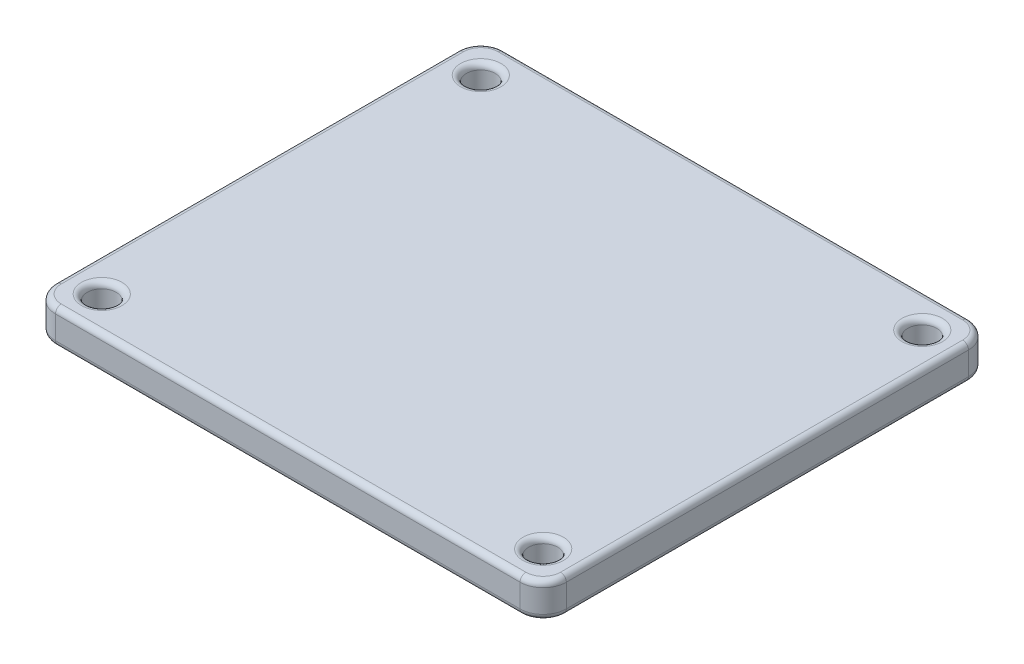
ISO-10303-21;
HEADER;
FILE_DESCRIPTION(('STEP AP214'),'2;1');
FILE_NAME('part.step','',(''),(''),'','','');
FILE_SCHEMA(('AUTOMOTIVE_DESIGN { 1 0 10303 214 1 1 1 1 }'));
ENDSEC;
DATA;
#1=APPLICATION_CONTEXT('core data for automotive mechanical design processes');
#2=APPLICATION_PROTOCOL_DEFINITION('international standard','automotive_design',2000,#1);
#3=PRODUCT_CONTEXT('',#1,'mechanical');
#4=PRODUCT('Part','Part','',(#3));
#5=PRODUCT_RELATED_PRODUCT_CATEGORY('part','',(#4));
#6=PRODUCT_DEFINITION_FORMATION('','',#4);
#7=PRODUCT_DEFINITION_CONTEXT('part definition',#1,'design');
#8=PRODUCT_DEFINITION('design','',#6,#7);
#9=PRODUCT_DEFINITION_SHAPE('','',#8);
#10=(LENGTH_UNIT() NAMED_UNIT(*) SI_UNIT(.MILLI.,.METRE.));
#11=(NAMED_UNIT(*) PLANE_ANGLE_UNIT() SI_UNIT($,.RADIAN.));
#12=(NAMED_UNIT(*) SI_UNIT($,.STERADIAN.) SOLID_ANGLE_UNIT());
#13=UNCERTAINTY_MEASURE_WITH_UNIT(LENGTH_MEASURE(1.E-05),#10,'distance_accuracy_value','');
#14=(GEOMETRIC_REPRESENTATION_CONTEXT(3) GLOBAL_UNCERTAINTY_ASSIGNED_CONTEXT((#13)) GLOBAL_UNIT_ASSIGNED_CONTEXT((#10,
#11,#12)) REPRESENTATION_CONTEXT('',''));
#15=CARTESIAN_POINT('',(0.,0.,0.));
#16=DIRECTION('',(0.,0.,1.));
#17=DIRECTION('',(1.,0.,0.));
#18=AXIS2_PLACEMENT_3D('',#15,#16,#17);
#19=CARTESIAN_POINT('',(20.1,3.,-17.4));
#20=DIRECTION('',(0.,-1.,0.));
#21=DIRECTION('',(0.,0.,-1.));
#22=AXIS2_PLACEMENT_3D('',#19,#20,#21);
#23=PLANE('',#22);
#24=CARTESIAN_POINT('',(-19.1,3.,16.4));
#25=DIRECTION('',(0.,-1.,0.));
#26=DIRECTION('',(0.,0.,-1.));
#27=AXIS2_PLACEMENT_3D('',#24,#25,#26);
#28=CIRCLE('',#27,1.75);
#29=CARTESIAN_POINT('',(-19.1,3.,14.65));
#30=VERTEX_POINT('',#29);
#31=EDGE_CURVE('E11',#30,#30,#28,.T.);
#32=ORIENTED_EDGE('',*,*,#31,.T.);
#33=EDGE_LOOP('',(#32));
#34=FACE_BOUND('',#33,.T.);
#35=CARTESIAN_POINT('',(19.1,3.,16.4));
#36=DIRECTION('',(0.,-1.,0.));
#37=DIRECTION('',(0.,0.,-1.));
#38=AXIS2_PLACEMENT_3D('',#35,#36,#37);
#39=CIRCLE('',#38,1.75);
#40=CARTESIAN_POINT('',(19.1,3.,14.65));
#41=VERTEX_POINT('',#40);
#42=EDGE_CURVE('E42',#41,#41,#39,.T.);
#43=ORIENTED_EDGE('',*,*,#42,.T.);
#44=EDGE_LOOP('',(#43));
#45=FACE_BOUND('',#44,.T.);
#46=CARTESIAN_POINT('',(19.1,3.,-16.4));
#47=DIRECTION('',(0.,-1.,0.));
#48=DIRECTION('',(0.,0.,-1.));
#49=AXIS2_PLACEMENT_3D('',#46,#47,#48);
#50=CIRCLE('',#49,1.75);
#51=CARTESIAN_POINT('',(19.1,3.,-18.15));
#52=VERTEX_POINT('',#51);
#53=EDGE_CURVE('E260',#52,#52,#50,.T.);
#54=ORIENTED_EDGE('',*,*,#53,.T.);
#55=EDGE_LOOP('',(#54));
#56=FACE_BOUND('',#55,.T.);
#57=CARTESIAN_POINT('',(-19.1,3.,-16.4));
#58=DIRECTION('',(0.,-1.,0.));
#59=DIRECTION('',(0.,0.,-1.));
#60=AXIS2_PLACEMENT_3D('',#57,#58,#59);
#61=CIRCLE('',#60,1.75);
#62=CARTESIAN_POINT('',(-19.1,3.,-18.15));
#63=VERTEX_POINT('',#62);
#64=EDGE_CURVE('E257',#63,#63,#61,.T.);
#65=ORIENTED_EDGE('',*,*,#64,.T.);
#66=EDGE_LOOP('',(#65));
#67=FACE_BOUND('',#66,.T.);
#68=CARTESIAN_POINT('',(20.1,3.,17.4));
#69=DIRECTION('',(0.,-1.,0.));
#70=DIRECTION('',(0.,0.,-1.));
#71=AXIS2_PLACEMENT_3D('',#68,#69,#70);
#72=CIRCLE('',#71,1.5);
#73=CARTESIAN_POINT('',(20.1,3.,18.9));
#74=VERTEX_POINT('',#73);
#75=CARTESIAN_POINT('',(21.6,3.,17.4));
#76=VERTEX_POINT('',#75);
#77=EDGE_CURVE('E50',#74,#76,#72,.F.);
#78=ORIENTED_EDGE('',*,*,#77,.T.);
#79=DIRECTION('',(0.,0.,-1.));
#80=VECTOR('',#79,1.);
#81=CARTESIAN_POINT('',(21.6,3.,-17.4));
#82=LINE('',#81,#80);
#83=CARTESIAN_POINT('',(21.6,3.,-17.4));
#84=VERTEX_POINT('',#83);
#85=EDGE_CURVE('E255',#76,#84,#82,.T.);
#86=ORIENTED_EDGE('',*,*,#85,.T.);
#87=CARTESIAN_POINT('',(20.1,3.,-17.4));
#88=DIRECTION('',(0.,-1.,0.));
#89=DIRECTION('',(0.,0.,-1.));
#90=AXIS2_PLACEMENT_3D('',#87,#88,#89);
#91=CIRCLE('',#90,1.5);
#92=CARTESIAN_POINT('',(20.1,3.,-18.9));
#93=VERTEX_POINT('',#92);
#94=EDGE_CURVE('E243',#84,#93,#91,.F.);
#95=ORIENTED_EDGE('',*,*,#94,.T.);
#96=DIRECTION('',(-1.,0.,0.));
#97=VECTOR('',#96,1.);
#98=CARTESIAN_POINT('',(20.1,3.,-18.9));
#99=LINE('',#98,#97);
#100=CARTESIAN_POINT('',(-20.1,3.,-18.9));
#101=VERTEX_POINT('',#100);
#102=EDGE_CURVE('E245',#93,#101,#99,.T.);
#103=ORIENTED_EDGE('',*,*,#102,.T.);
#104=CARTESIAN_POINT('',(-20.1,3.,-17.4));
#105=DIRECTION('',(0.,-1.,0.));
#106=DIRECTION('',(0.,0.,-1.));
#107=AXIS2_PLACEMENT_3D('',#104,#105,#106);
#108=CIRCLE('',#107,1.5);
#109=CARTESIAN_POINT('',(-21.6,3.,-17.4));
#110=VERTEX_POINT('',#109);
#111=EDGE_CURVE('E247',#101,#110,#108,.F.);
#112=ORIENTED_EDGE('',*,*,#111,.T.);
#113=DIRECTION('',(0.,0.,1.));
#114=VECTOR('',#113,1.);
#115=CARTESIAN_POINT('',(-21.6,3.,-17.4));
#116=LINE('',#115,#114);
#117=CARTESIAN_POINT('',(-21.6,3.,17.4));
#118=VERTEX_POINT('',#117);
#119=EDGE_CURVE('E249',#110,#118,#116,.T.);
#120=ORIENTED_EDGE('',*,*,#119,.T.);
#121=CARTESIAN_POINT('',(-20.1,3.,17.4));
#122=DIRECTION('',(0.,-1.,0.));
#123=DIRECTION('',(0.,0.,-1.));
#124=AXIS2_PLACEMENT_3D('',#121,#122,#123);
#125=CIRCLE('',#124,1.5);
#126=CARTESIAN_POINT('',(-20.1,3.,18.9));
#127=VERTEX_POINT('',#126);
#128=EDGE_CURVE('E251',#118,#127,#125,.F.);
#129=ORIENTED_EDGE('',*,*,#128,.T.);
#130=DIRECTION('',(1.,0.,0.));
#131=VECTOR('',#130,1.);
#132=CARTESIAN_POINT('',(20.1,3.,18.9));
#133=LINE('',#132,#131);
#134=EDGE_CURVE('E55',#127,#74,#133,.T.);
#135=ORIENTED_EDGE('',*,*,#134,.T.);
#136=EDGE_LOOP('',(#78,#86,#95,#103,#112,#120,#129,#135));
#137=FACE_BOUND('',#136,.T.);
#138=ADVANCED_FACE('F33',(#34,#45,#56,#67,#137),#23,.F.);
#139=CARTESIAN_POINT('',(20.1,0.,-17.4));
#140=DIRECTION('',(0.,-1.,0.));
#141=DIRECTION('',(0.,0.,-1.));
#142=AXIS2_PLACEMENT_3D('',#139,#140,#141);
#143=PLANE('',#142);
#144=CARTESIAN_POINT('',(-19.1,0.,16.4));
#145=DIRECTION('',(0.,-1.,0.));
#146=DIRECTION('',(0.,0.,-1.));
#147=AXIS2_PLACEMENT_3D('',#144,#145,#146);
#148=CIRCLE('',#147,1.75);
#149=CARTESIAN_POINT('',(-19.1,0.,14.65));
#150=VERTEX_POINT('',#149);
#151=EDGE_CURVE('E179',#150,#150,#148,.F.);
#152=ORIENTED_EDGE('',*,*,#151,.T.);
#153=EDGE_LOOP('',(#152));
#154=FACE_BOUND('',#153,.T.);
#155=CARTESIAN_POINT('',(19.1,0.,-16.4));
#156=DIRECTION('',(0.,-1.,0.));
#157=DIRECTION('',(0.,0.,-1.));
#158=AXIS2_PLACEMENT_3D('',#155,#156,#157);
#159=CIRCLE('',#158,1.75);
#160=CARTESIAN_POINT('',(19.1,0.,-18.15));
#161=VERTEX_POINT('',#160);
#162=EDGE_CURVE('E176',#161,#161,#159,.F.);
#163=ORIENTED_EDGE('',*,*,#162,.T.);
#164=EDGE_LOOP('',(#163));
#165=FACE_BOUND('',#164,.T.);
#166=CARTESIAN_POINT('',(-20.1,0.,-17.4));
#167=DIRECTION('',(0.,-1.,0.));
#168=DIRECTION('',(0.,0.,-1.));
#169=AXIS2_PLACEMENT_3D('',#166,#167,#168);
#170=CIRCLE('',#169,1.5);
#171=CARTESIAN_POINT('',(-21.6,0.,-17.4));
#172=VERTEX_POINT('',#171);
#173=CARTESIAN_POINT('',(-20.1,0.,-18.9));
#174=VERTEX_POINT('',#173);
#175=EDGE_CURVE('E175',#172,#174,#170,.T.);
#176=ORIENTED_EDGE('',*,*,#175,.T.);
#177=DIRECTION('',(-1.,0.,0.));
#178=VECTOR('',#177,1.);
#179=CARTESIAN_POINT('',(20.1,0.,-18.9));
#180=LINE('',#179,#178);
#181=CARTESIAN_POINT('',(20.1,0.,-18.9));
#182=VERTEX_POINT('',#181);
#183=EDGE_CURVE('E153',#174,#182,#180,.F.);
#184=ORIENTED_EDGE('',*,*,#183,.T.);
#185=CARTESIAN_POINT('',(20.1,0.,-17.4));
#186=DIRECTION('',(0.,-1.,0.));
#187=DIRECTION('',(0.,0.,-1.));
#188=AXIS2_PLACEMENT_3D('',#185,#186,#187);
#189=CIRCLE('',#188,1.5);
#190=CARTESIAN_POINT('',(21.6,0.,-17.4));
#191=VERTEX_POINT('',#190);
#192=EDGE_CURVE('E163',#182,#191,#189,.T.);
#193=ORIENTED_EDGE('',*,*,#192,.T.);
#194=DIRECTION('',(0.,0.,-1.));
#195=VECTOR('',#194,1.);
#196=CARTESIAN_POINT('',(21.6,0.,17.4));
#197=LINE('',#196,#195);
#198=CARTESIAN_POINT('',(21.6,0.,17.4));
#199=VERTEX_POINT('',#198);
#200=EDGE_CURVE('E169',#191,#199,#197,.F.);
#201=ORIENTED_EDGE('',*,*,#200,.T.);
#202=CARTESIAN_POINT('',(20.1,0.,17.4));
#203=DIRECTION('',(0.,-1.,0.));
#204=DIRECTION('',(0.,0.,-1.));
#205=AXIS2_PLACEMENT_3D('',#202,#203,#204);
#206=CIRCLE('',#205,1.5);
#207=CARTESIAN_POINT('',(20.1,0.,18.9));
#208=VERTEX_POINT('',#207);
#209=EDGE_CURVE('E343',#199,#208,#206,.T.);
#210=ORIENTED_EDGE('',*,*,#209,.T.);
#211=DIRECTION('',(1.,0.,0.));
#212=VECTOR('',#211,1.);
#213=CARTESIAN_POINT('',(-20.1,0.,18.9));
#214=LINE('',#213,#212);
#215=CARTESIAN_POINT('',(-20.1,0.,18.9));
#216=VERTEX_POINT('',#215);
#217=EDGE_CURVE('E345',#208,#216,#214,.F.);
#218=ORIENTED_EDGE('',*,*,#217,.T.);
#219=CARTESIAN_POINT('',(-20.1,0.,17.4));
#220=DIRECTION('',(0.,-1.,0.));
#221=DIRECTION('',(0.,0.,-1.));
#222=AXIS2_PLACEMENT_3D('',#219,#220,#221);
#223=CIRCLE('',#222,1.5);
#224=CARTESIAN_POINT('',(-21.6,0.,17.4));
#225=VERTEX_POINT('',#224);
#226=EDGE_CURVE('E347',#216,#225,#223,.T.);
#227=ORIENTED_EDGE('',*,*,#226,.T.);
#228=DIRECTION('',(0.,0.,1.));
#229=VECTOR('',#228,1.);
#230=CARTESIAN_POINT('',(-21.6,0.,-17.4));
#231=LINE('',#230,#229);
#232=EDGE_CURVE('E181',#225,#172,#231,.F.);
#233=ORIENTED_EDGE('',*,*,#232,.T.);
#234=EDGE_LOOP('',(#176,#184,#193,#201,#210,#218,#227,#233));
#235=FACE_BOUND('',#234,.T.);
#236=CARTESIAN_POINT('',(-19.1,0.,-16.4));
#237=DIRECTION('',(0.,-1.,0.));
#238=DIRECTION('',(0.,0.,-1.));
#239=AXIS2_PLACEMENT_3D('',#236,#237,#238);
#240=CIRCLE('',#239,1.75);
#241=CARTESIAN_POINT('',(-19.1,0.,-18.15));
#242=VERTEX_POINT('',#241);
#243=EDGE_CURVE('E170',#242,#242,#240,.F.);
#244=ORIENTED_EDGE('',*,*,#243,.T.);
#245=EDGE_LOOP('',(#244));
#246=FACE_BOUND('',#245,.T.);
#247=CARTESIAN_POINT('',(19.1,0.,16.4));
#248=DIRECTION('',(0.,-1.,0.));
#249=DIRECTION('',(0.,0.,-1.));
#250=AXIS2_PLACEMENT_3D('',#247,#248,#249);
#251=CIRCLE('',#250,1.75);
#252=CARTESIAN_POINT('',(19.1,0.,14.65));
#253=VERTEX_POINT('',#252);
#254=EDGE_CURVE('E337',#253,#253,#251,.F.);
#255=ORIENTED_EDGE('',*,*,#254,.T.);
#256=EDGE_LOOP('',(#255));
#257=FACE_BOUND('',#256,.T.);
#258=ADVANCED_FACE('F172',(#154,#165,#235,#246,#257),#143,.T.);
#259=CARTESIAN_POINT('',(20.1,3.,-17.4));
#260=DIRECTION('',(0.,-1.,0.));
#261=DIRECTION('',(0.,0.,-1.));
#262=AXIS2_PLACEMENT_3D('',#259,#260,#261);
#263=CYLINDRICAL_SURFACE('',#262,2.);
#264=DIRECTION('',(0.,-1.,0.));
#265=VECTOR('',#264,1.);
#266=CARTESIAN_POINT('',(22.1,3.,-17.4));
#267=LINE('',#266,#265);
#268=CARTESIAN_POINT('',(22.1,2.5,-17.4));
#269=VERTEX_POINT('',#268);
#270=CARTESIAN_POINT('',(22.1,0.5,-17.4));
#271=VERTEX_POINT('',#270);
#272=EDGE_CURVE('E281',#269,#271,#267,.T.);
#273=ORIENTED_EDGE('',*,*,#272,.T.);
#274=CARTESIAN_POINT('',(20.1,0.5,-17.4));
#275=DIRECTION('',(0.,-1.,0.));
#276=DIRECTION('',(0.,0.,-1.));
#277=AXIS2_PLACEMENT_3D('',#274,#275,#276);
#278=CIRCLE('',#277,2.);
#279=CARTESIAN_POINT('',(20.1,0.5,-19.4));
#280=VERTEX_POINT('',#279);
#281=EDGE_CURVE('E229',#271,#280,#278,.F.);
#282=ORIENTED_EDGE('',*,*,#281,.T.);
#283=DIRECTION('',(0.,-1.,0.));
#284=VECTOR('',#283,1.);
#285=CARTESIAN_POINT('',(20.1,3.,-19.4));
#286=LINE('',#285,#284);
#287=CARTESIAN_POINT('',(20.1,2.5,-19.4));
#288=VERTEX_POINT('',#287);
#289=EDGE_CURVE('E329',#288,#280,#286,.T.);
#290=ORIENTED_EDGE('',*,*,#289,.F.);
#291=CARTESIAN_POINT('',(20.1,2.5,-17.4));
#292=DIRECTION('',(0.,-1.,0.));
#293=DIRECTION('',(0.,0.,-1.));
#294=AXIS2_PLACEMENT_3D('',#291,#292,#293);
#295=CIRCLE('',#294,2.);
#296=EDGE_CURVE('E227',#288,#269,#295,.T.);
#297=ORIENTED_EDGE('',*,*,#296,.T.);
#298=EDGE_LOOP('',(#273,#282,#290,#297));
#299=FACE_BOUND('',#298,.T.);
#300=ADVANCED_FACE('F364',(#299),#263,.T.);
#301=CARTESIAN_POINT('',(-20.1,3.,-19.4));
#302=DIRECTION('',(0.,0.,1.));
#303=DIRECTION('',(1.,0.,0.));
#304=AXIS2_PLACEMENT_3D('',#301,#302,#303);
#305=PLANE('',#304);
#306=ORIENTED_EDGE('',*,*,#289,.T.);
#307=DIRECTION('',(-1.,0.,0.));
#308=VECTOR('',#307,1.);
#309=CARTESIAN_POINT('',(-20.1,0.5,-19.4));
#310=LINE('',#309,#308);
#311=CARTESIAN_POINT('',(-20.1,0.5,-19.4));
#312=VERTEX_POINT('',#311);
#313=EDGE_CURVE('E156',#280,#312,#310,.T.);
#314=ORIENTED_EDGE('',*,*,#313,.T.);
#315=DIRECTION('',(0.,-1.,0.));
#316=VECTOR('',#315,1.);
#317=CARTESIAN_POINT('',(-20.1,3.,-19.4));
#318=LINE('',#317,#316);
#319=CARTESIAN_POINT('',(-20.1,2.5,-19.4));
#320=VERTEX_POINT('',#319);
#321=EDGE_CURVE('E327',#320,#312,#318,.T.);
#322=ORIENTED_EDGE('',*,*,#321,.F.);
#323=DIRECTION('',(-1.,0.,0.));
#324=VECTOR('',#323,1.);
#325=CARTESIAN_POINT('',(-20.1,2.5,-19.4));
#326=LINE('',#325,#324);
#327=EDGE_CURVE('E199',#320,#288,#326,.F.);
#328=ORIENTED_EDGE('',*,*,#327,.T.);
#329=EDGE_LOOP('',(#306,#314,#322,#328));
#330=FACE_BOUND('',#329,.T.);
#331=ADVANCED_FACE('F357',(#330),#305,.F.);
#332=CARTESIAN_POINT('',(-20.1,3.,-17.4));
#333=DIRECTION('',(0.,-1.,0.));
#334=DIRECTION('',(0.,0.,-1.));
#335=AXIS2_PLACEMENT_3D('',#332,#333,#334);
#336=CYLINDRICAL_SURFACE('',#335,2.);
#337=ORIENTED_EDGE('',*,*,#321,.T.);
#338=CARTESIAN_POINT('',(-20.1,0.5,-17.4));
#339=DIRECTION('',(0.,-1.,0.));
#340=DIRECTION('',(0.,0.,-1.));
#341=AXIS2_PLACEMENT_3D('',#338,#339,#340);
#342=CIRCLE('',#341,2.);
#343=CARTESIAN_POINT('',(-22.1,0.5,-17.4));
#344=VERTEX_POINT('',#343);
#345=EDGE_CURVE('E204',#312,#344,#342,.F.);
#346=ORIENTED_EDGE('',*,*,#345,.T.);
#347=DIRECTION('',(0.,-1.,0.));
#348=VECTOR('',#347,1.);
#349=CARTESIAN_POINT('',(-22.1,3.,-17.4));
#350=LINE('',#349,#348);
#351=CARTESIAN_POINT('',(-22.1,2.5,-17.4));
#352=VERTEX_POINT('',#351);
#353=EDGE_CURVE('E318',#352,#344,#350,.T.);
#354=ORIENTED_EDGE('',*,*,#353,.F.);
#355=CARTESIAN_POINT('',(-20.1,2.5,-17.4));
#356=DIRECTION('',(0.,-1.,0.));
#357=DIRECTION('',(0.,0.,-1.));
#358=AXIS2_PLACEMENT_3D('',#355,#356,#357);
#359=CIRCLE('',#358,2.);
#360=EDGE_CURVE('E202',#352,#320,#359,.T.);
#361=ORIENTED_EDGE('',*,*,#360,.T.);
#362=EDGE_LOOP('',(#337,#346,#354,#361));
#363=FACE_BOUND('',#362,.T.);
#364=ADVANCED_FACE('F324',(#363),#336,.T.);
#365=CARTESIAN_POINT('',(-22.1,3.,-17.4));
#366=DIRECTION('',(1.,0.,0.));
#367=DIRECTION('',(0.,0.,-1.));
#368=AXIS2_PLACEMENT_3D('',#365,#366,#367);
#369=PLANE('',#368);
#370=ORIENTED_EDGE('',*,*,#353,.T.);
#371=DIRECTION('',(0.,0.,1.));
#372=VECTOR('',#371,1.);
#373=CARTESIAN_POINT('',(-22.1,0.5,17.4));
#374=LINE('',#373,#372);
#375=CARTESIAN_POINT('',(-22.1,0.5,17.4));
#376=VERTEX_POINT('',#375);
#377=EDGE_CURVE('E208',#344,#376,#374,.T.);
#378=ORIENTED_EDGE('',*,*,#377,.T.);
#379=DIRECTION('',(0.,-1.,0.));
#380=VECTOR('',#379,1.);
#381=CARTESIAN_POINT('',(-22.1,3.,17.4));
#382=LINE('',#381,#380);
#383=CARTESIAN_POINT('',(-22.1,2.5,17.4));
#384=VERTEX_POINT('',#383);
#385=EDGE_CURVE('E321',#384,#376,#382,.T.);
#386=ORIENTED_EDGE('',*,*,#385,.F.);
#387=DIRECTION('',(0.,0.,1.));
#388=VECTOR('',#387,1.);
#389=CARTESIAN_POINT('',(-22.1,2.5,-17.4));
#390=LINE('',#389,#388);
#391=EDGE_CURVE('E206',#384,#352,#390,.F.);
#392=ORIENTED_EDGE('',*,*,#391,.T.);
#393=EDGE_LOOP('',(#370,#378,#386,#392));
#394=FACE_BOUND('',#393,.T.);
#395=ADVANCED_FACE('F317',(#394),#369,.F.);
#396=CARTESIAN_POINT('',(-20.1,3.,17.4));
#397=DIRECTION('',(0.,-1.,0.));
#398=DIRECTION('',(0.,0.,-1.));
#399=AXIS2_PLACEMENT_3D('',#396,#397,#398);
#400=CYLINDRICAL_SURFACE('',#399,2.);
#401=ORIENTED_EDGE('',*,*,#385,.T.);
#402=CARTESIAN_POINT('',(-20.1,0.5,17.4));
#403=DIRECTION('',(0.,-1.,0.));
#404=DIRECTION('',(0.,0.,-1.));
#405=AXIS2_PLACEMENT_3D('',#402,#403,#404);
#406=CIRCLE('',#405,2.);
#407=CARTESIAN_POINT('',(-20.1,0.5,19.4));
#408=VERTEX_POINT('',#407);
#409=EDGE_CURVE('E212',#376,#408,#406,.F.);
#410=ORIENTED_EDGE('',*,*,#409,.T.);
#411=DIRECTION('',(0.,-1.,0.));
#412=VECTOR('',#411,1.);
#413=CARTESIAN_POINT('',(-20.1,3.,19.4));
#414=LINE('',#413,#412);
#415=CARTESIAN_POINT('',(-20.1,2.5,19.4));
#416=VERTEX_POINT('',#415);
#417=EDGE_CURVE('E331',#416,#408,#414,.T.);
#418=ORIENTED_EDGE('',*,*,#417,.F.);
#419=CARTESIAN_POINT('',(-20.1,2.5,17.4));
#420=DIRECTION('',(0.,-1.,0.));
#421=DIRECTION('',(0.,0.,-1.));
#422=AXIS2_PLACEMENT_3D('',#419,#420,#421);
#423=CIRCLE('',#422,2.);
#424=EDGE_CURVE('E210',#416,#384,#423,.T.);
#425=ORIENTED_EDGE('',*,*,#424,.T.);
#426=EDGE_LOOP('',(#401,#410,#418,#425));
#427=FACE_BOUND('',#426,.T.);
#428=ADVANCED_FACE('F409',(#427),#400,.T.);
#429=CARTESIAN_POINT('',(-20.1,3.,19.4));
#430=DIRECTION('',(0.,0.,-1.));
#431=DIRECTION('',(-1.,0.,0.));
#432=AXIS2_PLACEMENT_3D('',#429,#430,#431);
#433=PLANE('',#432);
#434=ORIENTED_EDGE('',*,*,#417,.T.);
#435=DIRECTION('',(1.,0.,0.));
#436=VECTOR('',#435,1.);
#437=CARTESIAN_POINT('',(20.1,0.5,19.4));
#438=LINE('',#437,#436);
#439=CARTESIAN_POINT('',(20.1,0.5,19.4));
#440=VERTEX_POINT('',#439);
#441=EDGE_CURVE('E216',#408,#440,#438,.T.);
#442=ORIENTED_EDGE('',*,*,#441,.T.);
#443=DIRECTION('',(0.,-1.,0.));
#444=VECTOR('',#443,1.);
#445=CARTESIAN_POINT('',(20.1,3.,19.4));
#446=LINE('',#445,#444);
#447=CARTESIAN_POINT('',(20.1,2.5,19.4));
#448=VERTEX_POINT('',#447);
#449=EDGE_CURVE('E390',#448,#440,#446,.T.);
#450=ORIENTED_EDGE('',*,*,#449,.F.);
#451=DIRECTION('',(1.,0.,0.));
#452=VECTOR('',#451,1.);
#453=CARTESIAN_POINT('',(-20.1,2.5,19.4));
#454=LINE('',#453,#452);
#455=EDGE_CURVE('E214',#448,#416,#454,.F.);
#456=ORIENTED_EDGE('',*,*,#455,.T.);
#457=EDGE_LOOP('',(#434,#442,#450,#456));
#458=FACE_BOUND('',#457,.T.);
#459=ADVANCED_FACE('F398',(#458),#433,.F.);
#460=CARTESIAN_POINT('',(20.1,3.,17.4));
#461=DIRECTION('',(0.,-1.,0.));
#462=DIRECTION('',(0.,0.,-1.));
#463=AXIS2_PLACEMENT_3D('',#460,#461,#462);
#464=CYLINDRICAL_SURFACE('',#463,2.);
#465=ORIENTED_EDGE('',*,*,#449,.T.);
#466=CARTESIAN_POINT('',(20.1,0.5,17.4));
#467=DIRECTION('',(0.,-1.,0.));
#468=DIRECTION('',(0.,0.,-1.));
#469=AXIS2_PLACEMENT_3D('',#466,#467,#468);
#470=CIRCLE('',#469,2.);
#471=CARTESIAN_POINT('',(22.1,0.5,17.4));
#472=VERTEX_POINT('',#471);
#473=EDGE_CURVE('E220',#440,#472,#470,.F.);
#474=ORIENTED_EDGE('',*,*,#473,.T.);
#475=DIRECTION('',(0.,-1.,0.));
#476=VECTOR('',#475,1.);
#477=CARTESIAN_POINT('',(22.1,3.,17.4));
#478=LINE('',#477,#476);
#479=CARTESIAN_POINT('',(22.1,2.5,17.4));
#480=VERTEX_POINT('',#479);
#481=EDGE_CURVE('E383',#480,#472,#478,.T.);
#482=ORIENTED_EDGE('',*,*,#481,.F.);
#483=CARTESIAN_POINT('',(20.1,2.5,17.4));
#484=DIRECTION('',(0.,-1.,0.));
#485=DIRECTION('',(0.,0.,-1.));
#486=AXIS2_PLACEMENT_3D('',#483,#484,#485);
#487=CIRCLE('',#486,2.);
#488=EDGE_CURVE('E218',#480,#448,#487,.T.);
#489=ORIENTED_EDGE('',*,*,#488,.T.);
#490=EDGE_LOOP('',(#465,#474,#482,#489));
#491=FACE_BOUND('',#490,.T.);
#492=ADVANCED_FACE('F387',(#491),#464,.T.);
#493=CARTESIAN_POINT('',(22.1,3.,-17.4));
#494=DIRECTION('',(-1.,0.,0.));
#495=DIRECTION('',(0.,0.,1.));
#496=AXIS2_PLACEMENT_3D('',#493,#494,#495);
#497=PLANE('',#496);
#498=ORIENTED_EDGE('',*,*,#481,.T.);
#499=DIRECTION('',(0.,0.,-1.));
#500=VECTOR('',#499,1.);
#501=CARTESIAN_POINT('',(22.1,0.5,-17.4));
#502=LINE('',#501,#500);
#503=EDGE_CURVE('E225',#472,#271,#502,.T.);
#504=ORIENTED_EDGE('',*,*,#503,.T.);
#505=ORIENTED_EDGE('',*,*,#272,.F.);
#506=DIRECTION('',(0.,0.,-1.));
#507=VECTOR('',#506,1.);
#508=CARTESIAN_POINT('',(22.1,2.5,-17.4));
#509=LINE('',#508,#507);
#510=EDGE_CURVE('E222',#269,#480,#509,.F.);
#511=ORIENTED_EDGE('',*,*,#510,.T.);
#512=EDGE_LOOP('',(#498,#504,#505,#511));
#513=FACE_BOUND('',#512,.T.);
#514=ADVANCED_FACE('F382',(#513),#497,.F.);
#515=CARTESIAN_POINT('',(-19.1,3.,-16.4));
#516=DIRECTION('',(0.,-1.,0.));
#517=DIRECTION('',(0.,0.,-1.));
#518=AXIS2_PLACEMENT_3D('',#515,#516,#517);
#519=CYLINDRICAL_SURFACE('',#518,1.25);
#520=CARTESIAN_POINT('',(-19.1,0.5,-16.4));
#521=DIRECTION('',(0.,-1.,0.));
#522=DIRECTION('',(0.,0.,-1.));
#523=AXIS2_PLACEMENT_3D('',#520,#521,#522);
#524=CIRCLE('',#523,1.25);
#525=CARTESIAN_POINT('',(-19.1,0.5,-17.65));
#526=VERTEX_POINT('',#525);
#527=EDGE_CURVE('E234',#526,#526,#524,.T.);
#528=ORIENTED_EDGE('',*,*,#527,.T.);
#529=EDGE_LOOP('',(#528));
#530=FACE_BOUND('',#529,.T.);
#531=CARTESIAN_POINT('',(-19.1,2.5,-16.4));
#532=DIRECTION('',(0.,-1.,0.));
#533=DIRECTION('',(0.,0.,-1.));
#534=AXIS2_PLACEMENT_3D('',#531,#532,#533);
#535=CIRCLE('',#534,1.25);
#536=CARTESIAN_POINT('',(-19.1,2.5,-17.65));
#537=VERTEX_POINT('',#536);
#538=EDGE_CURVE('E231',#537,#537,#535,.F.);
#539=ORIENTED_EDGE('',*,*,#538,.T.);
#540=EDGE_LOOP('',(#539));
#541=FACE_BOUND('',#540,.T.);
#542=ADVANCED_FACE('F428',(#530,#541),#519,.F.);
#543=CARTESIAN_POINT('',(19.1,3.,-16.4));
#544=DIRECTION('',(0.,-1.,0.));
#545=DIRECTION('',(0.,0.,-1.));
#546=AXIS2_PLACEMENT_3D('',#543,#544,#545);
#547=CYLINDRICAL_SURFACE('',#546,1.25);
#548=CARTESIAN_POINT('',(19.1,0.5,-16.4));
#549=DIRECTION('',(0.,-1.,0.));
#550=DIRECTION('',(0.,0.,-1.));
#551=AXIS2_PLACEMENT_3D('',#548,#549,#550);
#552=CIRCLE('',#551,1.25);
#553=CARTESIAN_POINT('',(19.1,0.5,-17.65));
#554=VERTEX_POINT('',#553);
#555=EDGE_CURVE('E196',#554,#554,#552,.T.);
#556=ORIENTED_EDGE('',*,*,#555,.T.);
#557=EDGE_LOOP('',(#556));
#558=FACE_BOUND('',#557,.T.);
#559=CARTESIAN_POINT('',(19.1,2.5,-16.4));
#560=DIRECTION('',(0.,-1.,0.));
#561=DIRECTION('',(0.,0.,-1.));
#562=AXIS2_PLACEMENT_3D('',#559,#560,#561);
#563=CIRCLE('',#562,1.25);
#564=CARTESIAN_POINT('',(19.1,2.5,-17.65));
#565=VERTEX_POINT('',#564);
#566=EDGE_CURVE('E193',#565,#565,#563,.F.);
#567=ORIENTED_EDGE('',*,*,#566,.T.);
#568=EDGE_LOOP('',(#567));
#569=FACE_BOUND('',#568,.T.);
#570=ADVANCED_FACE('F448',(#558,#569),#547,.F.);
#571=CARTESIAN_POINT('',(19.1,3.,16.4));
#572=DIRECTION('',(0.,-1.,0.));
#573=DIRECTION('',(0.,0.,-1.));
#574=AXIS2_PLACEMENT_3D('',#571,#572,#573);
#575=CYLINDRICAL_SURFACE('',#574,1.25);
#576=CARTESIAN_POINT('',(19.1,0.5,16.4));
#577=DIRECTION('',(0.,-1.,0.));
#578=DIRECTION('',(0.,0.,-1.));
#579=AXIS2_PLACEMENT_3D('',#576,#577,#578);
#580=CIRCLE('',#579,1.25);
#581=CARTESIAN_POINT('',(19.1,0.5,15.15));
#582=VERTEX_POINT('',#581);
#583=EDGE_CURVE('E240',#582,#582,#580,.T.);
#584=ORIENTED_EDGE('',*,*,#583,.T.);
#585=EDGE_LOOP('',(#584));
#586=FACE_BOUND('',#585,.T.);
#587=CARTESIAN_POINT('',(19.1,2.5,16.4));
#588=DIRECTION('',(0.,-1.,0.));
#589=DIRECTION('',(0.,0.,-1.));
#590=AXIS2_PLACEMENT_3D('',#587,#588,#589);
#591=CIRCLE('',#590,1.25);
#592=CARTESIAN_POINT('',(19.1,2.5,15.15));
#593=VERTEX_POINT('',#592);
#594=EDGE_CURVE('E237',#593,#593,#591,.F.);
#595=ORIENTED_EDGE('',*,*,#594,.T.);
#596=EDGE_LOOP('',(#595));
#597=FACE_BOUND('',#596,.T.);
#598=ADVANCED_FACE('F455',(#586,#597),#575,.F.);
#599=CARTESIAN_POINT('',(-19.1,3.,16.4));
#600=DIRECTION('',(0.,-1.,0.));
#601=DIRECTION('',(0.,0.,-1.));
#602=AXIS2_PLACEMENT_3D('',#599,#600,#601);
#603=CYLINDRICAL_SURFACE('',#602,1.25);
#604=CARTESIAN_POINT('',(-19.1,0.5,16.4));
#605=DIRECTION('',(0.,-1.,0.));
#606=DIRECTION('',(0.,0.,-1.));
#607=AXIS2_PLACEMENT_3D('',#604,#605,#606);
#608=CIRCLE('',#607,1.25);
#609=CARTESIAN_POINT('',(-19.1,0.5,15.15));
#610=VERTEX_POINT('',#609);
#611=EDGE_CURVE('E190',#610,#610,#608,.T.);
#612=ORIENTED_EDGE('',*,*,#611,.T.);
#613=EDGE_LOOP('',(#612));
#614=FACE_BOUND('',#613,.T.);
#615=CARTESIAN_POINT('',(-19.1,2.5,16.4));
#616=DIRECTION('',(0.,-1.,0.));
#617=DIRECTION('',(0.,0.,-1.));
#618=AXIS2_PLACEMENT_3D('',#615,#616,#617);
#619=CIRCLE('',#618,1.25);
#620=CARTESIAN_POINT('',(-19.1,2.5,15.15));
#621=VERTEX_POINT('',#620);
#622=EDGE_CURVE('E187',#621,#621,#619,.F.);
#623=ORIENTED_EDGE('',*,*,#622,.T.);
#624=EDGE_LOOP('',(#623));
#625=FACE_BOUND('',#624,.T.);
#626=ADVANCED_FACE('F462',(#614,#625),#603,.F.);
#627=CARTESIAN_POINT('',(-19.1,0.5,16.4));
#628=DIRECTION('',(0.,-1.,0.));
#629=DIRECTION('',(0.,0.,-1.));
#630=AXIS2_PLACEMENT_3D('',#627,#628,#629);
#631=TOROIDAL_SURFACE('',#630,1.75,0.5);
#632=ORIENTED_EDGE('',*,*,#611,.F.);
#633=EDGE_LOOP('',(#632));
#634=FACE_BOUND('',#633,.T.);
#635=ORIENTED_EDGE('',*,*,#151,.F.);
#636=EDGE_LOOP('',(#635));
#637=FACE_BOUND('',#636,.T.);
#638=ADVANCED_FACE('F470',(#634,#637),#631,.T.);
#639=CARTESIAN_POINT('',(19.1,0.5,-16.4));
#640=DIRECTION('',(0.,-1.,0.));
#641=DIRECTION('',(0.,0.,-1.));
#642=AXIS2_PLACEMENT_3D('',#639,#640,#641);
#643=TOROIDAL_SURFACE('',#642,1.75,0.5);
#644=ORIENTED_EDGE('',*,*,#555,.F.);
#645=EDGE_LOOP('',(#644));
#646=FACE_BOUND('',#645,.T.);
#647=ORIENTED_EDGE('',*,*,#162,.F.);
#648=EDGE_LOOP('',(#647));
#649=FACE_BOUND('',#648,.T.);
#650=ADVANCED_FACE('F479',(#646,#649),#643,.T.);
#651=CARTESIAN_POINT('',(-20.1,0.5,18.9));
#652=DIRECTION('',(-1.,0.,0.));
#653=DIRECTION('',(0.,0.,1.));
#654=AXIS2_PLACEMENT_3D('',#651,#652,#653);
#655=CYLINDRICAL_SURFACE('',#654,0.5);
#656=CARTESIAN_POINT('',(-20.1,0.5,18.9));
#657=DIRECTION('',(-1.,0.,0.));
#658=DIRECTION('',(0.,0.,1.));
#659=AXIS2_PLACEMENT_3D('',#656,#657,#658);
#660=CIRCLE('',#659,0.5);
#661=EDGE_CURVE('E275',#216,#408,#660,.T.);
#662=ORIENTED_EDGE('',*,*,#661,.F.);
#663=ORIENTED_EDGE('',*,*,#217,.F.);
#664=CARTESIAN_POINT('',(20.1,0.5,18.9));
#665=DIRECTION('',(1.,0.,0.));
#666=DIRECTION('',(0.,0.,-1.));
#667=AXIS2_PLACEMENT_3D('',#664,#665,#666);
#668=CIRCLE('',#667,0.5);
#669=EDGE_CURVE('E278',#440,#208,#668,.T.);
#670=ORIENTED_EDGE('',*,*,#669,.F.);
#671=ORIENTED_EDGE('',*,*,#441,.F.);
#672=EDGE_LOOP('',(#662,#663,#670,#671));
#673=FACE_BOUND('',#672,.T.);
#674=ADVANCED_FACE('F404',(#673),#655,.T.);
#675=CARTESIAN_POINT('',(20.1,0.5,17.4));
#676=DIRECTION('',(0.,-1.,0.));
#677=DIRECTION('',(0.,0.,-1.));
#678=AXIS2_PLACEMENT_3D('',#675,#676,#677);
#679=TOROIDAL_SURFACE('',#678,1.5,0.5);
#680=ORIENTED_EDGE('',*,*,#669,.T.);
#681=ORIENTED_EDGE('',*,*,#209,.F.);
#682=CARTESIAN_POINT('',(21.6,0.5,17.4));
#683=DIRECTION('',(0.,0.,-1.));
#684=DIRECTION('',(-1.,0.,0.));
#685=AXIS2_PLACEMENT_3D('',#682,#683,#684);
#686=CIRCLE('',#685,0.5);
#687=EDGE_CURVE('E272',#472,#199,#686,.T.);
#688=ORIENTED_EDGE('',*,*,#687,.F.);
#689=ORIENTED_EDGE('',*,*,#473,.F.);
#690=EDGE_LOOP('',(#680,#681,#688,#689));
#691=FACE_BOUND('',#690,.T.);
#692=ADVANCED_FACE('F498',(#691),#679,.T.);
#693=CARTESIAN_POINT('',(-20.1,0.5,17.4));
#694=DIRECTION('',(0.,-1.,0.));
#695=DIRECTION('',(0.,0.,-1.));
#696=AXIS2_PLACEMENT_3D('',#693,#694,#695);
#697=TOROIDAL_SURFACE('',#696,1.5,0.5);
#698=ORIENTED_EDGE('',*,*,#661,.T.);
#699=ORIENTED_EDGE('',*,*,#409,.F.);
#700=CARTESIAN_POINT('',(-21.6,0.5,17.4));
#701=DIRECTION('',(0.,0.,-1.));
#702=DIRECTION('',(-1.,0.,0.));
#703=AXIS2_PLACEMENT_3D('',#700,#701,#702);
#704=CIRCLE('',#703,0.5);
#705=EDGE_CURVE('E269',#225,#376,#704,.T.);
#706=ORIENTED_EDGE('',*,*,#705,.F.);
#707=ORIENTED_EDGE('',*,*,#226,.F.);
#708=EDGE_LOOP('',(#698,#699,#706,#707));
#709=FACE_BOUND('',#708,.T.);
#710=ADVANCED_FACE('F408',(#709),#697,.T.);
#711=CARTESIAN_POINT('',(21.6,0.5,-17.4));
#712=DIRECTION('',(0.,0.,1.));
#713=DIRECTION('',(1.,0.,0.));
#714=AXIS2_PLACEMENT_3D('',#711,#712,#713);
#715=CYLINDRICAL_SURFACE('',#714,0.5);
#716=ORIENTED_EDGE('',*,*,#687,.T.);
#717=ORIENTED_EDGE('',*,*,#200,.F.);
#718=CARTESIAN_POINT('',(21.6,0.5,-17.4));
#719=DIRECTION('',(0.,0.,-1.));
#720=DIRECTION('',(-1.,0.,0.));
#721=AXIS2_PLACEMENT_3D('',#718,#719,#720);
#722=CIRCLE('',#721,0.5);
#723=EDGE_CURVE('E166',#271,#191,#722,.T.);
#724=ORIENTED_EDGE('',*,*,#723,.F.);
#725=ORIENTED_EDGE('',*,*,#503,.F.);
#726=EDGE_LOOP('',(#716,#717,#724,#725));
#727=FACE_BOUND('',#726,.T.);
#728=ADVANCED_FACE('F516',(#727),#715,.T.);
#729=CARTESIAN_POINT('',(-21.6,0.5,-17.4));
#730=DIRECTION('',(0.,0.,-1.));
#731=DIRECTION('',(-1.,0.,0.));
#732=AXIS2_PLACEMENT_3D('',#729,#730,#731);
#733=CYLINDRICAL_SURFACE('',#732,0.5);
#734=ORIENTED_EDGE('',*,*,#705,.T.);
#735=ORIENTED_EDGE('',*,*,#377,.F.);
#736=CARTESIAN_POINT('',(-21.6,0.5,-17.4));
#737=DIRECTION('',(0.,0.,-1.));
#738=DIRECTION('',(-1.,0.,0.));
#739=AXIS2_PLACEMENT_3D('',#736,#737,#738);
#740=CIRCLE('',#739,0.5);
#741=EDGE_CURVE('E159',#172,#344,#740,.T.);
#742=ORIENTED_EDGE('',*,*,#741,.F.);
#743=ORIENTED_EDGE('',*,*,#232,.F.);
#744=EDGE_LOOP('',(#734,#735,#742,#743));
#745=FACE_BOUND('',#744,.T.);
#746=ADVANCED_FACE('F353',(#745),#733,.T.);
#747=CARTESIAN_POINT('',(20.1,0.5,-17.4));
#748=DIRECTION('',(0.,-1.,0.));
#749=DIRECTION('',(0.,0.,-1.));
#750=AXIS2_PLACEMENT_3D('',#747,#748,#749);
#751=TOROIDAL_SURFACE('',#750,1.5,0.5);
#752=ORIENTED_EDGE('',*,*,#723,.T.);
#753=ORIENTED_EDGE('',*,*,#192,.F.);
#754=CARTESIAN_POINT('',(20.1,0.5,-18.9));
#755=DIRECTION('',(-1.,0.,0.));
#756=DIRECTION('',(0.,-1.,0.));
#757=AXIS2_PLACEMENT_3D('',#754,#755,#756);
#758=CIRCLE('',#757,0.5);
#759=EDGE_CURVE('E149',#280,#182,#758,.T.);
#760=ORIENTED_EDGE('',*,*,#759,.F.);
#761=ORIENTED_EDGE('',*,*,#281,.F.);
#762=EDGE_LOOP('',(#752,#753,#760,#761));
#763=FACE_BOUND('',#762,.T.);
#764=ADVANCED_FACE('F164',(#763),#751,.T.);
#765=CARTESIAN_POINT('',(-20.1,0.5,-17.4));
#766=DIRECTION('',(0.,-1.,0.));
#767=DIRECTION('',(0.,0.,-1.));
#768=AXIS2_PLACEMENT_3D('',#765,#766,#767);
#769=TOROIDAL_SURFACE('',#768,1.5,0.5);
#770=ORIENTED_EDGE('',*,*,#741,.T.);
#771=ORIENTED_EDGE('',*,*,#345,.F.);
#772=CARTESIAN_POINT('',(-20.1,0.5,-18.9));
#773=DIRECTION('',(1.,0.,0.));
#774=DIRECTION('',(0.,0.,-1.));
#775=AXIS2_PLACEMENT_3D('',#772,#773,#774);
#776=CIRCLE('',#775,0.5);
#777=EDGE_CURVE('E160',#174,#312,#776,.T.);
#778=ORIENTED_EDGE('',*,*,#777,.F.);
#779=ORIENTED_EDGE('',*,*,#175,.F.);
#780=EDGE_LOOP('',(#770,#771,#778,#779));
#781=FACE_BOUND('',#780,.T.);
#782=ADVANCED_FACE('F355',(#781),#769,.T.);
#783=CARTESIAN_POINT('',(-20.1,0.5,-18.9));
#784=DIRECTION('',(1.,0.,0.));
#785=DIRECTION('',(0.,0.,-1.));
#786=AXIS2_PLACEMENT_3D('',#783,#784,#785);
#787=CYLINDRICAL_SURFACE('',#786,0.5);
#788=ORIENTED_EDGE('',*,*,#759,.T.);
#789=ORIENTED_EDGE('',*,*,#183,.F.);
#790=ORIENTED_EDGE('',*,*,#777,.T.);
#791=ORIENTED_EDGE('',*,*,#313,.F.);
#792=EDGE_LOOP('',(#788,#789,#790,#791));
#793=FACE_BOUND('',#792,.T.);
#794=ADVANCED_FACE('F151',(#793),#787,.T.);
#795=CARTESIAN_POINT('',(-19.1,0.5,-16.4));
#796=DIRECTION('',(0.,-1.,0.));
#797=DIRECTION('',(0.,0.,-1.));
#798=AXIS2_PLACEMENT_3D('',#795,#796,#797);
#799=TOROIDAL_SURFACE('',#798,1.75,0.5);
#800=ORIENTED_EDGE('',*,*,#527,.F.);
#801=EDGE_LOOP('',(#800));
#802=FACE_BOUND('',#801,.T.);
#803=ORIENTED_EDGE('',*,*,#243,.F.);
#804=EDGE_LOOP('',(#803));
#805=FACE_BOUND('',#804,.T.);
#806=ADVANCED_FACE('F558',(#802,#805),#799,.T.);
#807=CARTESIAN_POINT('',(19.1,0.5,16.4));
#808=DIRECTION('',(0.,-1.,0.));
#809=DIRECTION('',(0.,0.,-1.));
#810=AXIS2_PLACEMENT_3D('',#807,#808,#809);
#811=TOROIDAL_SURFACE('',#810,1.75,0.5);
#812=ORIENTED_EDGE('',*,*,#583,.F.);
#813=EDGE_LOOP('',(#812));
#814=FACE_BOUND('',#813,.T.);
#815=ORIENTED_EDGE('',*,*,#254,.F.);
#816=EDGE_LOOP('',(#815));
#817=FACE_BOUND('',#816,.T.);
#818=ADVANCED_FACE('F567',(#814,#817),#811,.T.);
#819=CARTESIAN_POINT('',(-19.1,2.5,16.4));
#820=DIRECTION('',(0.,-1.,0.));
#821=DIRECTION('',(0.,0.,-1.));
#822=AXIS2_PLACEMENT_3D('',#819,#820,#821);
#823=TOROIDAL_SURFACE('',#822,1.75,0.5);
#824=ORIENTED_EDGE('',*,*,#31,.F.);
#825=EDGE_LOOP('',(#824));
#826=FACE_BOUND('',#825,.T.);
#827=ORIENTED_EDGE('',*,*,#622,.F.);
#828=EDGE_LOOP('',(#827));
#829=FACE_BOUND('',#828,.T.);
#830=ADVANCED_FACE('F577',(#826,#829),#823,.T.);
#831=CARTESIAN_POINT('',(19.1,2.5,16.4));
#832=DIRECTION('',(0.,-1.,0.));
#833=DIRECTION('',(0.,0.,-1.));
#834=AXIS2_PLACEMENT_3D('',#831,#832,#833);
#835=TOROIDAL_SURFACE('',#834,1.75,0.5);
#836=ORIENTED_EDGE('',*,*,#42,.F.);
#837=EDGE_LOOP('',(#836));
#838=FACE_BOUND('',#837,.T.);
#839=ORIENTED_EDGE('',*,*,#594,.F.);
#840=EDGE_LOOP('',(#839));
#841=FACE_BOUND('',#840,.T.);
#842=ADVANCED_FACE('F587',(#838,#841),#835,.T.);
#843=CARTESIAN_POINT('',(19.1,2.5,-16.4));
#844=DIRECTION('',(0.,-1.,0.));
#845=DIRECTION('',(0.,0.,-1.));
#846=AXIS2_PLACEMENT_3D('',#843,#844,#845);
#847=TOROIDAL_SURFACE('',#846,1.75,0.5);
#848=ORIENTED_EDGE('',*,*,#53,.F.);
#849=EDGE_LOOP('',(#848));
#850=FACE_BOUND('',#849,.T.);
#851=ORIENTED_EDGE('',*,*,#566,.F.);
#852=EDGE_LOOP('',(#851));
#853=FACE_BOUND('',#852,.T.);
#854=ADVANCED_FACE('F597',(#850,#853),#847,.T.);
#855=CARTESIAN_POINT('',(-19.1,2.5,-16.4));
#856=DIRECTION('',(0.,-1.,0.));
#857=DIRECTION('',(0.,0.,-1.));
#858=AXIS2_PLACEMENT_3D('',#855,#856,#857);
#859=TOROIDAL_SURFACE('',#858,1.75,0.5);
#860=ORIENTED_EDGE('',*,*,#64,.F.);
#861=EDGE_LOOP('',(#860));
#862=FACE_BOUND('',#861,.T.);
#863=ORIENTED_EDGE('',*,*,#538,.F.);
#864=EDGE_LOOP('',(#863));
#865=FACE_BOUND('',#864,.T.);
#866=ADVANCED_FACE('F607',(#862,#865),#859,.T.);
#867=CARTESIAN_POINT('',(-21.6,2.5,-17.4));
#868=DIRECTION('',(0.,0.,1.));
#869=DIRECTION('',(1.,0.,0.));
#870=AXIS2_PLACEMENT_3D('',#867,#868,#869);
#871=CYLINDRICAL_SURFACE('',#870,0.5);
#872=CARTESIAN_POINT('',(-21.6,2.5,-17.4));
#873=DIRECTION('',(0.,0.,-1.));
#874=DIRECTION('',(-1.,0.,0.));
#875=AXIS2_PLACEMENT_3D('',#872,#873,#874);
#876=CIRCLE('',#875,0.5);
#877=EDGE_CURVE('E297',#352,#110,#876,.T.);
#878=ORIENTED_EDGE('',*,*,#877,.F.);
#879=ORIENTED_EDGE('',*,*,#391,.F.);
#880=CARTESIAN_POINT('',(-21.6,2.5,17.4));
#881=DIRECTION('',(0.,0.,1.));
#882=DIRECTION('',(1.,0.,0.));
#883=AXIS2_PLACEMENT_3D('',#880,#881,#882);
#884=CIRCLE('',#883,0.5);
#885=EDGE_CURVE('E37',#118,#384,#884,.T.);
#886=ORIENTED_EDGE('',*,*,#885,.F.);
#887=ORIENTED_EDGE('',*,*,#119,.F.);
#888=EDGE_LOOP('',(#878,#879,#886,#887));
#889=FACE_BOUND('',#888,.T.);
#890=ADVANCED_FACE('F35',(#889),#871,.T.);
#891=CARTESIAN_POINT('',(-20.1,2.5,17.4));
#892=DIRECTION('',(0.,-1.,0.));
#893=DIRECTION('',(0.,0.,-1.));
#894=AXIS2_PLACEMENT_3D('',#891,#892,#893);
#895=TOROIDAL_SURFACE('',#894,1.5,0.5);
#896=ORIENTED_EDGE('',*,*,#885,.T.);
#897=ORIENTED_EDGE('',*,*,#424,.F.);
#898=CARTESIAN_POINT('',(-20.1,2.5,18.9));
#899=DIRECTION('',(1.,0.,0.));
#900=DIRECTION('',(0.,0.,-1.));
#901=AXIS2_PLACEMENT_3D('',#898,#899,#900);
#902=CIRCLE('',#901,0.5);
#903=EDGE_CURVE('E295',#127,#416,#902,.T.);
#904=ORIENTED_EDGE('',*,*,#903,.F.);
#905=ORIENTED_EDGE('',*,*,#128,.F.);
#906=EDGE_LOOP('',(#896,#897,#904,#905));
#907=FACE_BOUND('',#906,.T.);
#908=ADVANCED_FACE('F308',(#907),#895,.T.);
#909=CARTESIAN_POINT('',(-20.1,2.5,-17.4));
#910=DIRECTION('',(0.,-1.,0.));
#911=DIRECTION('',(0.,0.,-1.));
#912=AXIS2_PLACEMENT_3D('',#909,#910,#911);
#913=TOROIDAL_SURFACE('',#912,1.5,0.5);
#914=ORIENTED_EDGE('',*,*,#877,.T.);
#915=ORIENTED_EDGE('',*,*,#111,.F.);
#916=CARTESIAN_POINT('',(-20.1,2.5,-18.9));
#917=DIRECTION('',(1.,0.,0.));
#918=DIRECTION('',(0.,0.,-1.));
#919=AXIS2_PLACEMENT_3D('',#916,#917,#918);
#920=CIRCLE('',#919,0.5);
#921=EDGE_CURVE('E292',#320,#101,#920,.T.);
#922=ORIENTED_EDGE('',*,*,#921,.F.);
#923=ORIENTED_EDGE('',*,*,#360,.F.);
#924=EDGE_LOOP('',(#914,#915,#922,#923));
#925=FACE_BOUND('',#924,.T.);
#926=ADVANCED_FACE('F633',(#925),#913,.T.);
#927=CARTESIAN_POINT('',(20.1,2.5,18.9));
#928=DIRECTION('',(1.,0.,0.));
#929=DIRECTION('',(0.,0.,-1.));
#930=AXIS2_PLACEMENT_3D('',#927,#928,#929);
#931=CYLINDRICAL_SURFACE('',#930,0.5);
#932=ORIENTED_EDGE('',*,*,#903,.T.);
#933=ORIENTED_EDGE('',*,*,#455,.F.);
#934=CARTESIAN_POINT('',(20.1,2.5,18.9));
#935=DIRECTION('',(1.,0.,0.));
#936=DIRECTION('',(0.,0.,-1.));
#937=AXIS2_PLACEMENT_3D('',#934,#935,#936);
#938=CIRCLE('',#937,0.5);
#939=EDGE_CURVE('E289',#74,#448,#938,.T.);
#940=ORIENTED_EDGE('',*,*,#939,.F.);
#941=ORIENTED_EDGE('',*,*,#134,.F.);
#942=EDGE_LOOP('',(#932,#933,#940,#941));
#943=FACE_BOUND('',#942,.T.);
#944=ADVANCED_FACE('F641',(#943),#931,.T.);
#945=CARTESIAN_POINT('',(20.1,2.5,-18.9));
#946=DIRECTION('',(-1.,0.,0.));
#947=DIRECTION('',(0.,0.,1.));
#948=AXIS2_PLACEMENT_3D('',#945,#946,#947);
#949=CYLINDRICAL_SURFACE('',#948,0.5);
#950=ORIENTED_EDGE('',*,*,#921,.T.);
#951=ORIENTED_EDGE('',*,*,#102,.F.);
#952=CARTESIAN_POINT('',(20.1,2.5,-18.9));
#953=DIRECTION('',(1.,0.,0.));
#954=DIRECTION('',(0.,0.,-1.));
#955=AXIS2_PLACEMENT_3D('',#952,#953,#954);
#956=CIRCLE('',#955,0.5);
#957=EDGE_CURVE('E286',#288,#93,#956,.T.);
#958=ORIENTED_EDGE('',*,*,#957,.F.);
#959=ORIENTED_EDGE('',*,*,#327,.F.);
#960=EDGE_LOOP('',(#950,#951,#958,#959));
#961=FACE_BOUND('',#960,.T.);
#962=ADVANCED_FACE('F369',(#961),#949,.T.);
#963=CARTESIAN_POINT('',(20.1,2.5,17.4));
#964=DIRECTION('',(0.,-1.,0.));
#965=DIRECTION('',(0.,0.,-1.));
#966=AXIS2_PLACEMENT_3D('',#963,#964,#965);
#967=TOROIDAL_SURFACE('',#966,1.5,0.5);
#968=ORIENTED_EDGE('',*,*,#939,.T.);
#969=ORIENTED_EDGE('',*,*,#488,.F.);
#970=CARTESIAN_POINT('',(21.6,2.5,17.4));
#971=DIRECTION('',(0.,0.,-1.));
#972=DIRECTION('',(-1.,0.,0.));
#973=AXIS2_PLACEMENT_3D('',#970,#971,#972);
#974=CIRCLE('',#973,0.5);
#975=EDGE_CURVE('E284',#76,#480,#974,.T.);
#976=ORIENTED_EDGE('',*,*,#975,.F.);
#977=ORIENTED_EDGE('',*,*,#77,.F.);
#978=EDGE_LOOP('',(#968,#969,#976,#977));
#979=FACE_BOUND('',#978,.T.);
#980=ADVANCED_FACE('F659',(#979),#967,.T.);
#981=CARTESIAN_POINT('',(20.1,2.5,-17.4));
#982=DIRECTION('',(0.,-1.,0.));
#983=DIRECTION('',(0.,0.,-1.));
#984=AXIS2_PLACEMENT_3D('',#981,#982,#983);
#985=TOROIDAL_SURFACE('',#984,1.5,0.5);
#986=ORIENTED_EDGE('',*,*,#957,.T.);
#987=ORIENTED_EDGE('',*,*,#94,.F.);
#988=CARTESIAN_POINT('',(21.6,2.5,-17.4));
#989=DIRECTION('',(0.,0.,1.));
#990=DIRECTION('',(0.,-1.,0.));
#991=AXIS2_PLACEMENT_3D('',#988,#989,#990);
#992=CIRCLE('',#991,0.5);
#993=EDGE_CURVE('E282',#269,#84,#992,.T.);
#994=ORIENTED_EDGE('',*,*,#993,.F.);
#995=ORIENTED_EDGE('',*,*,#296,.F.);
#996=EDGE_LOOP('',(#986,#987,#994,#995));
#997=FACE_BOUND('',#996,.T.);
#998=ADVANCED_FACE('F373',(#997),#985,.T.);
#999=CARTESIAN_POINT('',(21.6,2.5,-17.4));
#1000=DIRECTION('',(0.,0.,-1.));
#1001=DIRECTION('',(-1.,0.,0.));
#1002=AXIS2_PLACEMENT_3D('',#999,#1000,#1001);
#1003=CYLINDRICAL_SURFACE('',#1002,0.5);
#1004=ORIENTED_EDGE('',*,*,#975,.T.);
#1005=ORIENTED_EDGE('',*,*,#510,.F.);
#1006=ORIENTED_EDGE('',*,*,#993,.T.);
#1007=ORIENTED_EDGE('',*,*,#85,.F.);
#1008=EDGE_LOOP('',(#1004,#1005,#1006,#1007));
#1009=FACE_BOUND('',#1008,.T.);
#1010=ADVANCED_FACE('F377',(#1009),#1003,.T.);
#1011=CLOSED_SHELL('',(#138,#258,#300,#331,#364,#395,#428,#459,#492,#514,#542,#570,#598,#626,
#638,#650,#674,#692,#710,#728,#746,#764,#782,#794,#806,#818,#830,#842,#854,#866,#890,#908,#926,
#944,#962,#980,#998,#1010));
#1012=MANIFOLD_SOLID_BREP('B2',#1011);
#1013=ADVANCED_BREP_SHAPE_REPRESENTATION('',(#18,#1012),#14);
#1014=SHAPE_DEFINITION_REPRESENTATION(#9,#1013);
ENDSEC;
END-ISO-10303-21;
